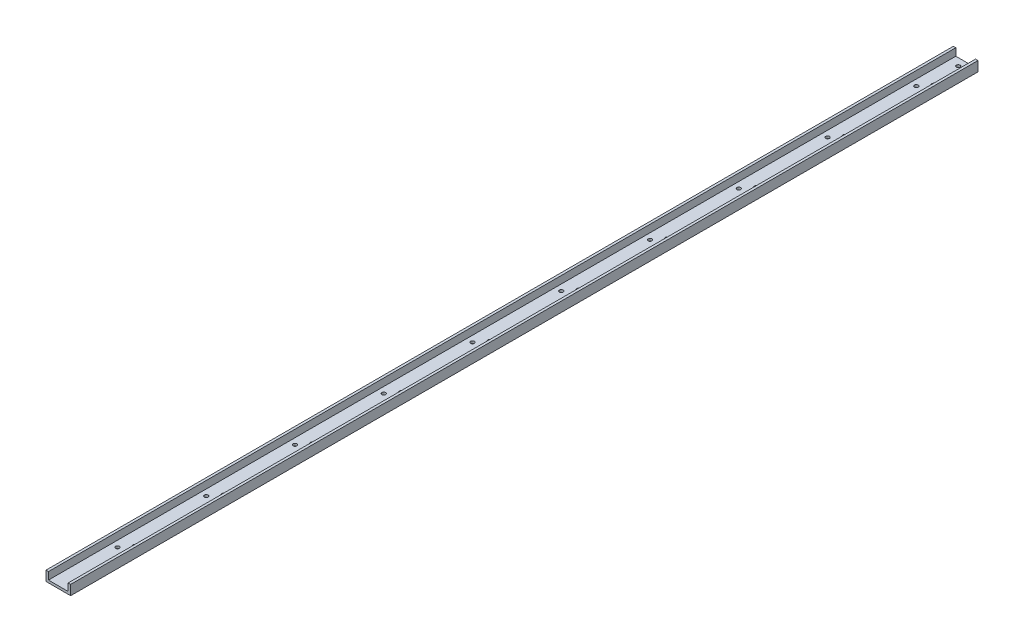
ISO-10303-21;
HEADER;
FILE_DESCRIPTION(('STEP AP214'),'2;1');
FILE_NAME('part.step','',(''),(''),'','','');
FILE_SCHEMA(('AUTOMOTIVE_DESIGN { 1 0 10303 214 1 1 1 1 }'));
ENDSEC;
DATA;
#1=APPLICATION_CONTEXT('core data for automotive mechanical design processes');
#2=APPLICATION_PROTOCOL_DEFINITION('international standard','automotive_design',2000,#1);
#3=PRODUCT_CONTEXT('',#1,'mechanical');
#4=PRODUCT('Part','Part','',(#3));
#5=PRODUCT_RELATED_PRODUCT_CATEGORY('part','',(#4));
#6=PRODUCT_DEFINITION_FORMATION('','',#4);
#7=PRODUCT_DEFINITION_CONTEXT('part definition',#1,'design');
#8=PRODUCT_DEFINITION('design','',#6,#7);
#9=PRODUCT_DEFINITION_SHAPE('','',#8);
#10=(LENGTH_UNIT() NAMED_UNIT(*) SI_UNIT(.MILLI.,.METRE.));
#11=(NAMED_UNIT(*) PLANE_ANGLE_UNIT() SI_UNIT($,.RADIAN.));
#12=(NAMED_UNIT(*) SI_UNIT($,.STERADIAN.) SOLID_ANGLE_UNIT());
#13=UNCERTAINTY_MEASURE_WITH_UNIT(LENGTH_MEASURE(1.E-05),#10,'distance_accuracy_value','');
#14=(GEOMETRIC_REPRESENTATION_CONTEXT(3) GLOBAL_UNCERTAINTY_ASSIGNED_CONTEXT((#13)) GLOBAL_UNIT_ASSIGNED_CONTEXT((#10,
#11,#12)) REPRESENTATION_CONTEXT('',''));
#15=CARTESIAN_POINT('',(0.,0.,0.));
#16=DIRECTION('',(0.,0.,1.));
#17=DIRECTION('',(1.,0.,0.));
#18=AXIS2_PLACEMENT_3D('',#15,#16,#17);
#19=CARTESIAN_POINT('',(20.6375,-0.00100000000000013,-93.6624999999999));
#20=DIRECTION('',(0.,1.,0.));
#21=DIRECTION('',(0.,0.,-1.));
#22=AXIS2_PLACEMENT_3D('',#19,#20,#21);
#23=CYLINDRICAL_SURFACE('',#22,2.41300000000001);
#24=CARTESIAN_POINT('',(20.6375,3.175,-93.6624999999999));
#25=DIRECTION('',(0.,-1.,0.));
#26=DIRECTION('',(0.,0.,-1.));
#27=AXIS2_PLACEMENT_3D('',#24,#25,#26);
#28=CIRCLE('',#27,2.41300000000001);
#29=CARTESIAN_POINT('',(20.6375,3.175,-96.0754999999999));
#30=VERTEX_POINT('',#29);
#31=EDGE_CURVE('E43',#30,#30,#28,.T.);
#32=ORIENTED_EDGE('',*,*,#31,.F.);
#33=EDGE_LOOP('',(#32));
#34=FACE_BOUND('',#33,.T.);
#35=CARTESIAN_POINT('',(20.6375,0.,-93.6624999999999));
#36=DIRECTION('',(0.,-1.,0.));
#37=DIRECTION('',(0.,0.,-1.));
#38=AXIS2_PLACEMENT_3D('',#35,#36,#37);
#39=CIRCLE('',#38,2.41300000000001);
#40=CARTESIAN_POINT('',(20.6375,0.,-96.0754999999999));
#41=VERTEX_POINT('',#40);
#42=EDGE_CURVE('E11',#41,#41,#39,.F.);
#43=ORIENTED_EDGE('',*,*,#42,.F.);
#44=EDGE_LOOP('',(#43));
#45=FACE_BOUND('',#44,.T.);
#46=ADVANCED_FACE('F35',(#34,#45),#23,.F.);
#47=CARTESIAN_POINT('',(20.6375,-0.00100000000000013,-207.9625));
#48=DIRECTION('',(0.,1.,0.));
#49=DIRECTION('',(0.,0.,-1.));
#50=AXIS2_PLACEMENT_3D('',#47,#48,#49);
#51=CYLINDRICAL_SURFACE('',#50,2.41300000000001);
#52=CARTESIAN_POINT('',(20.6375,3.175,-207.9625));
#53=DIRECTION('',(0.,-1.,0.));
#54=DIRECTION('',(0.,0.,-1.));
#55=AXIS2_PLACEMENT_3D('',#52,#53,#54);
#56=CIRCLE('',#55,2.41300000000001);
#57=CARTESIAN_POINT('',(20.6375,3.175,-210.3755));
#58=VERTEX_POINT('',#57);
#59=EDGE_CURVE('E251',#58,#58,#56,.T.);
#60=ORIENTED_EDGE('',*,*,#59,.F.);
#61=EDGE_LOOP('',(#60));
#62=FACE_BOUND('',#61,.T.);
#63=CARTESIAN_POINT('',(20.6375,0.,-207.9625));
#64=DIRECTION('',(0.,-1.,0.));
#65=DIRECTION('',(0.,0.,-1.));
#66=AXIS2_PLACEMENT_3D('',#63,#64,#65);
#67=CIRCLE('',#66,2.41300000000001);
#68=CARTESIAN_POINT('',(20.6375,0.,-210.3755));
#69=VERTEX_POINT('',#68);
#70=EDGE_CURVE('E254',#69,#69,#67,.F.);
#71=ORIENTED_EDGE('',*,*,#70,.F.);
#72=EDGE_LOOP('',(#71));
#73=FACE_BOUND('',#72,.T.);
#74=ADVANCED_FACE('F262',(#62,#73),#51,.F.);
#75=CARTESIAN_POINT('',(20.6375,-0.00100000000000013,-322.2625));
#76=DIRECTION('',(0.,1.,0.));
#77=DIRECTION('',(0.,0.,-1.));
#78=AXIS2_PLACEMENT_3D('',#75,#76,#77);
#79=CYLINDRICAL_SURFACE('',#78,2.41300000000001);
#80=CARTESIAN_POINT('',(20.6375,3.175,-322.2625));
#81=DIRECTION('',(0.,-1.,0.));
#82=DIRECTION('',(0.,0.,-1.));
#83=AXIS2_PLACEMENT_3D('',#80,#81,#82);
#84=CIRCLE('',#83,2.41300000000001);
#85=CARTESIAN_POINT('',(20.6375,3.175,-324.6755));
#86=VERTEX_POINT('',#85);
#87=EDGE_CURVE('E245',#86,#86,#84,.T.);
#88=ORIENTED_EDGE('',*,*,#87,.F.);
#89=EDGE_LOOP('',(#88));
#90=FACE_BOUND('',#89,.T.);
#91=CARTESIAN_POINT('',(20.6375,0.,-322.2625));
#92=DIRECTION('',(0.,-1.,0.));
#93=DIRECTION('',(0.,0.,-1.));
#94=AXIS2_PLACEMENT_3D('',#91,#92,#93);
#95=CIRCLE('',#94,2.41300000000001);
#96=CARTESIAN_POINT('',(20.6375,0.,-324.6755));
#97=VERTEX_POINT('',#96);
#98=EDGE_CURVE('E248',#97,#97,#95,.F.);
#99=ORIENTED_EDGE('',*,*,#98,.F.);
#100=EDGE_LOOP('',(#99));
#101=FACE_BOUND('',#100,.T.);
#102=ADVANCED_FACE('F335',(#90,#101),#79,.F.);
#103=CARTESIAN_POINT('',(20.6375,-0.00100000000000013,-436.5625));
#104=DIRECTION('',(0.,1.,0.));
#105=DIRECTION('',(0.,0.,-1.));
#106=AXIS2_PLACEMENT_3D('',#103,#104,#105);
#107=CYLINDRICAL_SURFACE('',#106,2.41300000000001);
#108=CARTESIAN_POINT('',(20.6375,3.175,-436.5625));
#109=DIRECTION('',(0.,-1.,0.));
#110=DIRECTION('',(0.,0.,-1.));
#111=AXIS2_PLACEMENT_3D('',#108,#109,#110);
#112=CIRCLE('',#111,2.41300000000001);
#113=CARTESIAN_POINT('',(20.6375,3.175,-438.9755));
#114=VERTEX_POINT('',#113);
#115=EDGE_CURVE('E239',#114,#114,#112,.T.);
#116=ORIENTED_EDGE('',*,*,#115,.F.);
#117=EDGE_LOOP('',(#116));
#118=FACE_BOUND('',#117,.T.);
#119=CARTESIAN_POINT('',(20.6375,0.,-436.5625));
#120=DIRECTION('',(0.,-1.,0.));
#121=DIRECTION('',(0.,0.,-1.));
#122=AXIS2_PLACEMENT_3D('',#119,#120,#121);
#123=CIRCLE('',#122,2.41300000000001);
#124=CARTESIAN_POINT('',(20.6375,0.,-438.9755));
#125=VERTEX_POINT('',#124);
#126=EDGE_CURVE('E242',#125,#125,#123,.F.);
#127=ORIENTED_EDGE('',*,*,#126,.F.);
#128=EDGE_LOOP('',(#127));
#129=FACE_BOUND('',#128,.T.);
#130=ADVANCED_FACE('F331',(#118,#129),#107,.F.);
#131=CARTESIAN_POINT('',(20.6375,-0.00100000000000013,-550.8625));
#132=DIRECTION('',(0.,1.,0.));
#133=DIRECTION('',(0.,0.,-1.));
#134=AXIS2_PLACEMENT_3D('',#131,#132,#133);
#135=CYLINDRICAL_SURFACE('',#134,2.41300000000001);
#136=CARTESIAN_POINT('',(20.6375,3.175,-550.8625));
#137=DIRECTION('',(0.,-1.,0.));
#138=DIRECTION('',(0.,0.,-1.));
#139=AXIS2_PLACEMENT_3D('',#136,#137,#138);
#140=CIRCLE('',#139,2.41300000000001);
#141=CARTESIAN_POINT('',(20.6375,3.175,-553.2755));
#142=VERTEX_POINT('',#141);
#143=EDGE_CURVE('E233',#142,#142,#140,.T.);
#144=ORIENTED_EDGE('',*,*,#143,.F.);
#145=EDGE_LOOP('',(#144));
#146=FACE_BOUND('',#145,.T.);
#147=CARTESIAN_POINT('',(20.6375,0.,-550.8625));
#148=DIRECTION('',(0.,-1.,0.));
#149=DIRECTION('',(0.,0.,-1.));
#150=AXIS2_PLACEMENT_3D('',#147,#148,#149);
#151=CIRCLE('',#150,2.41300000000001);
#152=CARTESIAN_POINT('',(20.6375,0.,-553.2755));
#153=VERTEX_POINT('',#152);
#154=EDGE_CURVE('E236',#153,#153,#151,.F.);
#155=ORIENTED_EDGE('',*,*,#154,.F.);
#156=EDGE_LOOP('',(#155));
#157=FACE_BOUND('',#156,.T.);
#158=ADVANCED_FACE('F327',(#146,#157),#135,.F.);
#159=CARTESIAN_POINT('',(20.6375,-0.00100000000000013,-665.1625));
#160=DIRECTION('',(0.,1.,0.));
#161=DIRECTION('',(0.,0.,-1.));
#162=AXIS2_PLACEMENT_3D('',#159,#160,#161);
#163=CYLINDRICAL_SURFACE('',#162,2.41300000000001);
#164=CARTESIAN_POINT('',(20.6375,3.175,-665.1625));
#165=DIRECTION('',(0.,-1.,0.));
#166=DIRECTION('',(0.,0.,-1.));
#167=AXIS2_PLACEMENT_3D('',#164,#165,#166);
#168=CIRCLE('',#167,2.41300000000001);
#169=CARTESIAN_POINT('',(20.6375,3.175,-667.5755));
#170=VERTEX_POINT('',#169);
#171=EDGE_CURVE('E227',#170,#170,#168,.T.);
#172=ORIENTED_EDGE('',*,*,#171,.F.);
#173=EDGE_LOOP('',(#172));
#174=FACE_BOUND('',#173,.T.);
#175=CARTESIAN_POINT('',(20.6375,0.,-665.1625));
#176=DIRECTION('',(0.,-1.,0.));
#177=DIRECTION('',(0.,0.,-1.));
#178=AXIS2_PLACEMENT_3D('',#175,#176,#177);
#179=CIRCLE('',#178,2.41300000000001);
#180=CARTESIAN_POINT('',(20.6375,0.,-667.5755));
#181=VERTEX_POINT('',#180);
#182=EDGE_CURVE('E230',#181,#181,#179,.F.);
#183=ORIENTED_EDGE('',*,*,#182,.F.);
#184=EDGE_LOOP('',(#183));
#185=FACE_BOUND('',#184,.T.);
#186=ADVANCED_FACE('F323',(#174,#185),#163,.F.);
#187=CARTESIAN_POINT('',(20.6375,-0.00100000000000013,-779.4625));
#188=DIRECTION('',(0.,1.,0.));
#189=DIRECTION('',(0.,0.,-1.));
#190=AXIS2_PLACEMENT_3D('',#187,#188,#189);
#191=CYLINDRICAL_SURFACE('',#190,2.41300000000001);
#192=CARTESIAN_POINT('',(20.6375,3.175,-779.4625));
#193=DIRECTION('',(0.,-1.,0.));
#194=DIRECTION('',(0.,0.,-1.));
#195=AXIS2_PLACEMENT_3D('',#192,#193,#194);
#196=CIRCLE('',#195,2.41300000000001);
#197=CARTESIAN_POINT('',(20.6375,3.175,-781.8755));
#198=VERTEX_POINT('',#197);
#199=EDGE_CURVE('E221',#198,#198,#196,.T.);
#200=ORIENTED_EDGE('',*,*,#199,.F.);
#201=EDGE_LOOP('',(#200));
#202=FACE_BOUND('',#201,.T.);
#203=CARTESIAN_POINT('',(20.6375,0.,-779.4625));
#204=DIRECTION('',(0.,-1.,0.));
#205=DIRECTION('',(0.,0.,-1.));
#206=AXIS2_PLACEMENT_3D('',#203,#204,#205);
#207=CIRCLE('',#206,2.41300000000001);
#208=CARTESIAN_POINT('',(20.6375,0.,-781.8755));
#209=VERTEX_POINT('',#208);
#210=EDGE_CURVE('E224',#209,#209,#207,.F.);
#211=ORIENTED_EDGE('',*,*,#210,.F.);
#212=EDGE_LOOP('',(#211));
#213=FACE_BOUND('',#212,.T.);
#214=ADVANCED_FACE('F319',(#202,#213),#191,.F.);
#215=CARTESIAN_POINT('',(20.6375,-0.00100000000000013,-893.7625));
#216=DIRECTION('',(0.,1.,0.));
#217=DIRECTION('',(0.,0.,-1.));
#218=AXIS2_PLACEMENT_3D('',#215,#216,#217);
#219=CYLINDRICAL_SURFACE('',#218,2.41300000000001);
#220=CARTESIAN_POINT('',(20.6375,3.175,-893.7625));
#221=DIRECTION('',(0.,-1.,0.));
#222=DIRECTION('',(0.,0.,-1.));
#223=AXIS2_PLACEMENT_3D('',#220,#221,#222);
#224=CIRCLE('',#223,2.41300000000001);
#225=CARTESIAN_POINT('',(20.6375,3.175,-896.1755));
#226=VERTEX_POINT('',#225);
#227=EDGE_CURVE('E215',#226,#226,#224,.T.);
#228=ORIENTED_EDGE('',*,*,#227,.F.);
#229=EDGE_LOOP('',(#228));
#230=FACE_BOUND('',#229,.T.);
#231=CARTESIAN_POINT('',(20.6375,0.,-893.7625));
#232=DIRECTION('',(0.,-1.,0.));
#233=DIRECTION('',(0.,0.,-1.));
#234=AXIS2_PLACEMENT_3D('',#231,#232,#233);
#235=CIRCLE('',#234,2.41300000000001);
#236=CARTESIAN_POINT('',(20.6375,0.,-896.1755));
#237=VERTEX_POINT('',#236);
#238=EDGE_CURVE('E218',#237,#237,#235,.F.);
#239=ORIENTED_EDGE('',*,*,#238,.F.);
#240=EDGE_LOOP('',(#239));
#241=FACE_BOUND('',#240,.T.);
#242=ADVANCED_FACE('F315',(#230,#241),#219,.F.);
#243=CARTESIAN_POINT('',(11.1125,-0.00100000000000013,-80.9625));
#244=DIRECTION('',(0.,1.,0.));
#245=DIRECTION('',(0.,0.,-1.));
#246=AXIS2_PLACEMENT_3D('',#243,#244,#245);
#247=CYLINDRICAL_SURFACE('',#246,2.41300000000005);
#248=CARTESIAN_POINT('',(11.1125,3.175,-80.9625));
#249=DIRECTION('',(0.,-1.,0.));
#250=DIRECTION('',(0.,0.,-1.));
#251=AXIS2_PLACEMENT_3D('',#248,#249,#250);
#252=CIRCLE('',#251,2.41300000000005);
#253=CARTESIAN_POINT('',(11.1125,3.175,-83.3755000000001));
#254=VERTEX_POINT('',#253);
#255=EDGE_CURVE('E209',#254,#254,#252,.T.);
#256=ORIENTED_EDGE('',*,*,#255,.F.);
#257=EDGE_LOOP('',(#256));
#258=FACE_BOUND('',#257,.T.);
#259=CARTESIAN_POINT('',(11.1125,0.,-80.9625));
#260=DIRECTION('',(0.,-1.,0.));
#261=DIRECTION('',(0.,0.,-1.));
#262=AXIS2_PLACEMENT_3D('',#259,#260,#261);
#263=CIRCLE('',#262,2.41300000000005);
#264=CARTESIAN_POINT('',(11.1125,0.,-83.3755000000001));
#265=VERTEX_POINT('',#264);
#266=EDGE_CURVE('E212',#265,#265,#263,.F.);
#267=ORIENTED_EDGE('',*,*,#266,.F.);
#268=EDGE_LOOP('',(#267));
#269=FACE_BOUND('',#268,.T.);
#270=ADVANCED_FACE('F311',(#258,#269),#247,.F.);
#271=CARTESIAN_POINT('',(11.1125,-0.00100000000000013,-195.2625));
#272=DIRECTION('',(0.,1.,0.));
#273=DIRECTION('',(0.,0.,-1.));
#274=AXIS2_PLACEMENT_3D('',#271,#272,#273);
#275=CYLINDRICAL_SURFACE('',#274,2.41300000000005);
#276=CARTESIAN_POINT('',(11.1125,3.175,-195.2625));
#277=DIRECTION('',(0.,-1.,0.));
#278=DIRECTION('',(0.,0.,-1.));
#279=AXIS2_PLACEMENT_3D('',#276,#277,#278);
#280=CIRCLE('',#279,2.41300000000005);
#281=CARTESIAN_POINT('',(11.1125,3.175,-197.6755));
#282=VERTEX_POINT('',#281);
#283=EDGE_CURVE('E203',#282,#282,#280,.T.);
#284=ORIENTED_EDGE('',*,*,#283,.F.);
#285=EDGE_LOOP('',(#284));
#286=FACE_BOUND('',#285,.T.);
#287=CARTESIAN_POINT('',(11.1125,0.,-195.2625));
#288=DIRECTION('',(0.,-1.,0.));
#289=DIRECTION('',(0.,0.,-1.));
#290=AXIS2_PLACEMENT_3D('',#287,#288,#289);
#291=CIRCLE('',#290,2.41300000000005);
#292=CARTESIAN_POINT('',(11.1125,0.,-197.6755));
#293=VERTEX_POINT('',#292);
#294=EDGE_CURVE('E206',#293,#293,#291,.F.);
#295=ORIENTED_EDGE('',*,*,#294,.F.);
#296=EDGE_LOOP('',(#295));
#297=FACE_BOUND('',#296,.T.);
#298=ADVANCED_FACE('F307',(#286,#297),#275,.F.);
#299=CARTESIAN_POINT('',(11.1125,-0.00100000000000013,-309.5625));
#300=DIRECTION('',(0.,1.,0.));
#301=DIRECTION('',(0.,0.,-1.));
#302=AXIS2_PLACEMENT_3D('',#299,#300,#301);
#303=CYLINDRICAL_SURFACE('',#302,2.41300000000005);
#304=CARTESIAN_POINT('',(11.1125,3.175,-309.5625));
#305=DIRECTION('',(0.,-1.,0.));
#306=DIRECTION('',(0.,0.,-1.));
#307=AXIS2_PLACEMENT_3D('',#304,#305,#306);
#308=CIRCLE('',#307,2.41300000000005);
#309=CARTESIAN_POINT('',(11.1125,3.175,-311.9755));
#310=VERTEX_POINT('',#309);
#311=EDGE_CURVE('E197',#310,#310,#308,.T.);
#312=ORIENTED_EDGE('',*,*,#311,.F.);
#313=EDGE_LOOP('',(#312));
#314=FACE_BOUND('',#313,.T.);
#315=CARTESIAN_POINT('',(11.1125,0.,-309.5625));
#316=DIRECTION('',(0.,-1.,0.));
#317=DIRECTION('',(0.,0.,-1.));
#318=AXIS2_PLACEMENT_3D('',#315,#316,#317);
#319=CIRCLE('',#318,2.41300000000005);
#320=CARTESIAN_POINT('',(11.1125,0.,-311.9755));
#321=VERTEX_POINT('',#320);
#322=EDGE_CURVE('E200',#321,#321,#319,.F.);
#323=ORIENTED_EDGE('',*,*,#322,.F.);
#324=EDGE_LOOP('',(#323));
#325=FACE_BOUND('',#324,.T.);
#326=ADVANCED_FACE('F303',(#314,#325),#303,.F.);
#327=CARTESIAN_POINT('',(11.1125,-0.00100000000000013,-423.8625));
#328=DIRECTION('',(0.,1.,0.));
#329=DIRECTION('',(0.,0.,-1.));
#330=AXIS2_PLACEMENT_3D('',#327,#328,#329);
#331=CYLINDRICAL_SURFACE('',#330,2.41300000000005);
#332=CARTESIAN_POINT('',(11.1125,3.175,-423.8625));
#333=DIRECTION('',(0.,-1.,0.));
#334=DIRECTION('',(0.,0.,-1.));
#335=AXIS2_PLACEMENT_3D('',#332,#333,#334);
#336=CIRCLE('',#335,2.41300000000005);
#337=CARTESIAN_POINT('',(11.1125,3.175,-426.2755));
#338=VERTEX_POINT('',#337);
#339=EDGE_CURVE('E191',#338,#338,#336,.T.);
#340=ORIENTED_EDGE('',*,*,#339,.F.);
#341=EDGE_LOOP('',(#340));
#342=FACE_BOUND('',#341,.T.);
#343=CARTESIAN_POINT('',(11.1125,0.,-423.8625));
#344=DIRECTION('',(0.,-1.,0.));
#345=DIRECTION('',(0.,0.,-1.));
#346=AXIS2_PLACEMENT_3D('',#343,#344,#345);
#347=CIRCLE('',#346,2.41300000000005);
#348=CARTESIAN_POINT('',(11.1125,0.,-426.2755));
#349=VERTEX_POINT('',#348);
#350=EDGE_CURVE('E194',#349,#349,#347,.F.);
#351=ORIENTED_EDGE('',*,*,#350,.F.);
#352=EDGE_LOOP('',(#351));
#353=FACE_BOUND('',#352,.T.);
#354=ADVANCED_FACE('F299',(#342,#353),#331,.F.);
#355=CARTESIAN_POINT('',(11.1125,-0.00100000000000013,-538.1625));
#356=DIRECTION('',(0.,1.,0.));
#357=DIRECTION('',(0.,0.,-1.));
#358=AXIS2_PLACEMENT_3D('',#355,#356,#357);
#359=CYLINDRICAL_SURFACE('',#358,2.41300000000005);
#360=CARTESIAN_POINT('',(11.1125,3.175,-538.1625));
#361=DIRECTION('',(0.,-1.,0.));
#362=DIRECTION('',(0.,0.,-1.));
#363=AXIS2_PLACEMENT_3D('',#360,#361,#362);
#364=CIRCLE('',#363,2.41300000000005);
#365=CARTESIAN_POINT('',(11.1125,3.175,-540.5755));
#366=VERTEX_POINT('',#365);
#367=EDGE_CURVE('E185',#366,#366,#364,.T.);
#368=ORIENTED_EDGE('',*,*,#367,.F.);
#369=EDGE_LOOP('',(#368));
#370=FACE_BOUND('',#369,.T.);
#371=CARTESIAN_POINT('',(11.1125,0.,-538.1625));
#372=DIRECTION('',(0.,-1.,0.));
#373=DIRECTION('',(0.,0.,-1.));
#374=AXIS2_PLACEMENT_3D('',#371,#372,#373);
#375=CIRCLE('',#374,2.41300000000005);
#376=CARTESIAN_POINT('',(11.1125,0.,-540.5755));
#377=VERTEX_POINT('',#376);
#378=EDGE_CURVE('E188',#377,#377,#375,.F.);
#379=ORIENTED_EDGE('',*,*,#378,.F.);
#380=EDGE_LOOP('',(#379));
#381=FACE_BOUND('',#380,.T.);
#382=ADVANCED_FACE('F295',(#370,#381),#359,.F.);
#383=CARTESIAN_POINT('',(11.1125,-0.00100000000000013,-652.4625));
#384=DIRECTION('',(0.,1.,0.));
#385=DIRECTION('',(0.,0.,-1.));
#386=AXIS2_PLACEMENT_3D('',#383,#384,#385);
#387=CYLINDRICAL_SURFACE('',#386,2.41300000000005);
#388=CARTESIAN_POINT('',(11.1125,3.175,-652.4625));
#389=DIRECTION('',(0.,-1.,0.));
#390=DIRECTION('',(0.,0.,-1.));
#391=AXIS2_PLACEMENT_3D('',#388,#389,#390);
#392=CIRCLE('',#391,2.41300000000005);
#393=CARTESIAN_POINT('',(11.1125,3.175,-654.8755));
#394=VERTEX_POINT('',#393);
#395=EDGE_CURVE('E179',#394,#394,#392,.T.);
#396=ORIENTED_EDGE('',*,*,#395,.F.);
#397=EDGE_LOOP('',(#396));
#398=FACE_BOUND('',#397,.T.);
#399=CARTESIAN_POINT('',(11.1125,0.,-652.4625));
#400=DIRECTION('',(0.,-1.,0.));
#401=DIRECTION('',(0.,0.,-1.));
#402=AXIS2_PLACEMENT_3D('',#399,#400,#401);
#403=CIRCLE('',#402,2.41300000000005);
#404=CARTESIAN_POINT('',(11.1125,0.,-654.8755));
#405=VERTEX_POINT('',#404);
#406=EDGE_CURVE('E182',#405,#405,#403,.F.);
#407=ORIENTED_EDGE('',*,*,#406,.F.);
#408=EDGE_LOOP('',(#407));
#409=FACE_BOUND('',#408,.T.);
#410=ADVANCED_FACE('F291',(#398,#409),#387,.F.);
#411=CARTESIAN_POINT('',(11.1125,-0.00100000000000013,-766.7625));
#412=DIRECTION('',(0.,1.,0.));
#413=DIRECTION('',(0.,0.,-1.));
#414=AXIS2_PLACEMENT_3D('',#411,#412,#413);
#415=CYLINDRICAL_SURFACE('',#414,2.41300000000005);
#416=CARTESIAN_POINT('',(11.1125,3.175,-766.7625));
#417=DIRECTION('',(0.,-1.,0.));
#418=DIRECTION('',(0.,0.,-1.));
#419=AXIS2_PLACEMENT_3D('',#416,#417,#418);
#420=CIRCLE('',#419,2.41300000000005);
#421=CARTESIAN_POINT('',(11.1125,3.175,-769.1755));
#422=VERTEX_POINT('',#421);
#423=EDGE_CURVE('E173',#422,#422,#420,.T.);
#424=ORIENTED_EDGE('',*,*,#423,.F.);
#425=EDGE_LOOP('',(#424));
#426=FACE_BOUND('',#425,.T.);
#427=CARTESIAN_POINT('',(11.1125,0.,-766.7625));
#428=DIRECTION('',(0.,-1.,0.));
#429=DIRECTION('',(0.,0.,-1.));
#430=AXIS2_PLACEMENT_3D('',#427,#428,#429);
#431=CIRCLE('',#430,2.41300000000005);
#432=CARTESIAN_POINT('',(11.1125,0.,-769.1755));
#433=VERTEX_POINT('',#432);
#434=EDGE_CURVE('E176',#433,#433,#431,.F.);
#435=ORIENTED_EDGE('',*,*,#434,.F.);
#436=EDGE_LOOP('',(#435));
#437=FACE_BOUND('',#436,.T.);
#438=ADVANCED_FACE('F287',(#426,#437),#415,.F.);
#439=CARTESIAN_POINT('',(11.1125,-0.00100000000000013,-881.0625));
#440=DIRECTION('',(0.,1.,0.));
#441=DIRECTION('',(0.,0.,-1.));
#442=AXIS2_PLACEMENT_3D('',#439,#440,#441);
#443=CYLINDRICAL_SURFACE('',#442,2.41300000000005);
#444=CARTESIAN_POINT('',(11.1125,3.175,-881.0625));
#445=DIRECTION('',(0.,-1.,0.));
#446=DIRECTION('',(0.,0.,-1.));
#447=AXIS2_PLACEMENT_3D('',#444,#445,#446);
#448=CIRCLE('',#447,2.41300000000005);
#449=CARTESIAN_POINT('',(11.1125,3.175,-883.4755));
#450=VERTEX_POINT('',#449);
#451=EDGE_CURVE('E167',#450,#450,#448,.T.);
#452=ORIENTED_EDGE('',*,*,#451,.F.);
#453=EDGE_LOOP('',(#452));
#454=FACE_BOUND('',#453,.T.);
#455=CARTESIAN_POINT('',(11.1125,0.,-881.0625));
#456=DIRECTION('',(0.,-1.,0.));
#457=DIRECTION('',(0.,0.,-1.));
#458=AXIS2_PLACEMENT_3D('',#455,#456,#457);
#459=CIRCLE('',#458,2.41300000000005);
#460=CARTESIAN_POINT('',(11.1125,0.,-883.4755));
#461=VERTEX_POINT('',#460);
#462=EDGE_CURVE('E170',#461,#461,#459,.F.);
#463=ORIENTED_EDGE('',*,*,#462,.F.);
#464=EDGE_LOOP('',(#463));
#465=FACE_BOUND('',#464,.T.);
#466=ADVANCED_FACE('F278',(#454,#465),#443,.F.);
#467=CARTESIAN_POINT('',(0.,0.,-1168.4));
#468=DIRECTION('',(1.,0.,0.));
#469=DIRECTION('',(0.,0.,1.));
#470=AXIS2_PLACEMENT_3D('',#467,#468,#469);
#471=PLANE('',#470);
#472=DIRECTION('',(0.,-1.,0.));
#473=VECTOR('',#472,1.);
#474=CARTESIAN_POINT('',(0.,0.,0.));
#475=LINE('',#474,#473);
#476=CARTESIAN_POINT('',(0.,12.7,0.));
#477=VERTEX_POINT('',#476);
#478=CARTESIAN_POINT('',(0.,0.,0.));
#479=VERTEX_POINT('',#478);
#480=EDGE_CURVE('E132',#477,#479,#475,.T.);
#481=ORIENTED_EDGE('',*,*,#480,.F.);
#482=DIRECTION('',(0.,0.,1.));
#483=VECTOR('',#482,1.);
#484=CARTESIAN_POINT('',(0.,12.7,-1168.4));
#485=LINE('',#484,#483);
#486=CARTESIAN_POINT('',(0.,12.7,-1168.4));
#487=VERTEX_POINT('',#486);
#488=EDGE_CURVE('E131',#487,#477,#485,.T.);
#489=ORIENTED_EDGE('',*,*,#488,.F.);
#490=DIRECTION('',(0.,-1.,0.));
#491=VECTOR('',#490,1.);
#492=CARTESIAN_POINT('',(0.,0.,-1168.4));
#493=LINE('',#492,#491);
#494=CARTESIAN_POINT('',(0.,0.,-1168.4));
#495=VERTEX_POINT('',#494);
#496=EDGE_CURVE('E151',#487,#495,#493,.T.);
#497=ORIENTED_EDGE('',*,*,#496,.T.);
#498=DIRECTION('',(0.,0.,1.));
#499=VECTOR('',#498,1.);
#500=CARTESIAN_POINT('',(0.,0.,-1168.4));
#501=LINE('',#500,#499);
#502=EDGE_CURVE('E164',#495,#479,#501,.T.);
#503=ORIENTED_EDGE('',*,*,#502,.T.);
#504=EDGE_LOOP('',(#481,#489,#497,#503));
#505=FACE_BOUND('',#504,.T.);
#506=ADVANCED_FACE('F268',(#505),#471,.F.);
#507=CARTESIAN_POINT('',(0.,0.,-1168.4));
#508=DIRECTION('',(0.,1.,0.));
#509=DIRECTION('',(0.,0.,-1.));
#510=AXIS2_PLACEMENT_3D('',#507,#508,#509);
#511=PLANE('',#510);
#512=CARTESIAN_POINT('',(20.6375,0.,-1008.0625));
#513=DIRECTION('',(0.,-1.,0.));
#514=DIRECTION('',(0.,0.,-1.));
#515=AXIS2_PLACEMENT_3D('',#512,#513,#514);
#516=CIRCLE('',#515,2.41300000000001);
#517=CARTESIAN_POINT('',(20.6375,0.,-1010.4755));
#518=VERTEX_POINT('',#517);
#519=EDGE_CURVE('E406',#518,#518,#516,.F.);
#520=ORIENTED_EDGE('',*,*,#519,.T.);
#521=EDGE_LOOP('',(#520));
#522=FACE_BOUND('',#521,.T.);
#523=CARTESIAN_POINT('',(11.1125,0.,-995.3625));
#524=DIRECTION('',(0.,-1.,0.));
#525=DIRECTION('',(0.,0.,-1.));
#526=AXIS2_PLACEMENT_3D('',#523,#524,#525);
#527=CIRCLE('',#526,2.41300000000005);
#528=CARTESIAN_POINT('',(11.1125,0.,-997.7755));
#529=VERTEX_POINT('',#528);
#530=EDGE_CURVE('E400',#529,#529,#527,.F.);
#531=ORIENTED_EDGE('',*,*,#530,.T.);
#532=EDGE_LOOP('',(#531));
#533=FACE_BOUND('',#532,.T.);
#534=CARTESIAN_POINT('',(15.875,0.,-1158.875));
#535=DIRECTION('',(0.,-1.,0.));
#536=DIRECTION('',(0.,0.,-1.));
#537=AXIS2_PLACEMENT_3D('',#534,#535,#536);
#538=CIRCLE('',#537,2.41299999999998);
#539=CARTESIAN_POINT('',(15.875,0.,-1161.288));
#540=VERTEX_POINT('',#539);
#541=EDGE_CURVE('E390',#540,#540,#538,.F.);
#542=ORIENTED_EDGE('',*,*,#541,.T.);
#543=EDGE_LOOP('',(#542));
#544=FACE_BOUND('',#543,.T.);
#545=CARTESIAN_POINT('',(11.1125,0.,-1109.6625));
#546=DIRECTION('',(0.,-1.,0.));
#547=DIRECTION('',(0.,0.,-1.));
#548=AXIS2_PLACEMENT_3D('',#545,#546,#547);
#549=CIRCLE('',#548,2.41300000000005);
#550=CARTESIAN_POINT('',(11.1125,0.,-1112.0755));
#551=VERTEX_POINT('',#550);
#552=EDGE_CURVE('E135',#551,#551,#549,.F.);
#553=ORIENTED_EDGE('',*,*,#552,.T.);
#554=EDGE_LOOP('',(#553));
#555=FACE_BOUND('',#554,.T.);
#556=CARTESIAN_POINT('',(20.6375,0.,-1122.3625));
#557=DIRECTION('',(0.,-1.,0.));
#558=DIRECTION('',(0.,0.,-1.));
#559=AXIS2_PLACEMENT_3D('',#556,#557,#558);
#560=CIRCLE('',#559,2.41300000000001);
#561=CARTESIAN_POINT('',(20.6375,0.,-1124.7755));
#562=VERTEX_POINT('',#561);
#563=EDGE_CURVE('E382',#562,#562,#560,.F.);
#564=ORIENTED_EDGE('',*,*,#563,.T.);
#565=EDGE_LOOP('',(#564));
#566=FACE_BOUND('',#565,.T.);
#567=DIRECTION('',(1.,0.,0.));
#568=VECTOR('',#567,1.);
#569=CARTESIAN_POINT('',(0.,0.,0.));
#570=LINE('',#569,#568);
#571=CARTESIAN_POINT('',(31.75,0.,0.));
#572=VERTEX_POINT('',#571);
#573=EDGE_CURVE('E134',#479,#572,#570,.T.);
#574=ORIENTED_EDGE('',*,*,#573,.F.);
#575=ORIENTED_EDGE('',*,*,#502,.F.);
#576=DIRECTION('',(1.,0.,0.));
#577=VECTOR('',#576,1.);
#578=CARTESIAN_POINT('',(0.,0.,-1168.4));
#579=LINE('',#578,#577);
#580=CARTESIAN_POINT('',(31.75,0.,-1168.4));
#581=VERTEX_POINT('',#580);
#582=EDGE_CURVE('E89',#495,#581,#579,.T.);
#583=ORIENTED_EDGE('',*,*,#582,.T.);
#584=DIRECTION('',(0.,0.,1.));
#585=VECTOR('',#584,1.);
#586=CARTESIAN_POINT('',(31.75,0.,-1168.4));
#587=LINE('',#586,#585);
#588=EDGE_CURVE('E161',#581,#572,#587,.T.);
#589=ORIENTED_EDGE('',*,*,#588,.T.);
#590=EDGE_LOOP('',(#574,#575,#583,#589));
#591=FACE_BOUND('',#590,.T.);
#592=ORIENTED_EDGE('',*,*,#462,.T.);
#593=EDGE_LOOP('',(#592));
#594=FACE_BOUND('',#593,.T.);
#595=ORIENTED_EDGE('',*,*,#434,.T.);
#596=EDGE_LOOP('',(#595));
#597=FACE_BOUND('',#596,.T.);
#598=ORIENTED_EDGE('',*,*,#406,.T.);
#599=EDGE_LOOP('',(#598));
#600=FACE_BOUND('',#599,.T.);
#601=ORIENTED_EDGE('',*,*,#378,.T.);
#602=EDGE_LOOP('',(#601));
#603=FACE_BOUND('',#602,.T.);
#604=ORIENTED_EDGE('',*,*,#350,.T.);
#605=EDGE_LOOP('',(#604));
#606=FACE_BOUND('',#605,.T.);
#607=ORIENTED_EDGE('',*,*,#322,.T.);
#608=EDGE_LOOP('',(#607));
#609=FACE_BOUND('',#608,.T.);
#610=ORIENTED_EDGE('',*,*,#294,.T.);
#611=EDGE_LOOP('',(#610));
#612=FACE_BOUND('',#611,.T.);
#613=ORIENTED_EDGE('',*,*,#266,.T.);
#614=EDGE_LOOP('',(#613));
#615=FACE_BOUND('',#614,.T.);
#616=ORIENTED_EDGE('',*,*,#238,.T.);
#617=EDGE_LOOP('',(#616));
#618=FACE_BOUND('',#617,.T.);
#619=ORIENTED_EDGE('',*,*,#210,.T.);
#620=EDGE_LOOP('',(#619));
#621=FACE_BOUND('',#620,.T.);
#622=ORIENTED_EDGE('',*,*,#182,.T.);
#623=EDGE_LOOP('',(#622));
#624=FACE_BOUND('',#623,.T.);
#625=ORIENTED_EDGE('',*,*,#154,.T.);
#626=EDGE_LOOP('',(#625));
#627=FACE_BOUND('',#626,.T.);
#628=ORIENTED_EDGE('',*,*,#126,.T.);
#629=EDGE_LOOP('',(#628));
#630=FACE_BOUND('',#629,.T.);
#631=ORIENTED_EDGE('',*,*,#98,.T.);
#632=EDGE_LOOP('',(#631));
#633=FACE_BOUND('',#632,.T.);
#634=ORIENTED_EDGE('',*,*,#70,.T.);
#635=EDGE_LOOP('',(#634));
#636=FACE_BOUND('',#635,.T.);
#637=ORIENTED_EDGE('',*,*,#42,.T.);
#638=EDGE_LOOP('',(#637));
#639=FACE_BOUND('',#638,.T.);
#640=ADVANCED_FACE('F265',(#522,#533,#544,#555,#566,#591,#594,#597,#600,#603,#606,#609,#612,
#615,#618,#621,#624,#627,#630,#633,#636,#639),#511,.F.);
#641=CARTESIAN_POINT('',(31.75,0.,-1168.4));
#642=DIRECTION('',(-1.,0.,0.));
#643=DIRECTION('',(0.,0.,-1.));
#644=AXIS2_PLACEMENT_3D('',#641,#642,#643);
#645=PLANE('',#644);
#646=DIRECTION('',(0.,1.,0.));
#647=VECTOR('',#646,1.);
#648=CARTESIAN_POINT('',(31.75,0.,0.));
#649=LINE('',#648,#647);
#650=CARTESIAN_POINT('',(31.75,12.7,0.));
#651=VERTEX_POINT('',#650);
#652=EDGE_CURVE('E138',#572,#651,#649,.T.);
#653=ORIENTED_EDGE('',*,*,#652,.F.);
#654=ORIENTED_EDGE('',*,*,#588,.F.);
#655=DIRECTION('',(0.,1.,0.));
#656=VECTOR('',#655,1.);
#657=CARTESIAN_POINT('',(31.75,0.,-1168.4));
#658=LINE('',#657,#656);
#659=CARTESIAN_POINT('',(31.75,12.7,-1168.4));
#660=VERTEX_POINT('',#659);
#661=EDGE_CURVE('E372',#581,#660,#658,.T.);
#662=ORIENTED_EDGE('',*,*,#661,.T.);
#663=DIRECTION('',(0.,0.,1.));
#664=VECTOR('',#663,1.);
#665=CARTESIAN_POINT('',(31.75,12.7,-1168.4));
#666=LINE('',#665,#664);
#667=EDGE_CURVE('E158',#660,#651,#666,.T.);
#668=ORIENTED_EDGE('',*,*,#667,.T.);
#669=EDGE_LOOP('',(#653,#654,#662,#668));
#670=FACE_BOUND('',#669,.T.);
#671=ADVANCED_FACE('F267',(#670),#645,.F.);
#672=CARTESIAN_POINT('',(31.75,12.7,-1168.4));
#673=DIRECTION('',(0.,-1.,0.));
#674=DIRECTION('',(0.,0.,1.));
#675=AXIS2_PLACEMENT_3D('',#672,#673,#674);
#676=PLANE('',#675);
#677=DIRECTION('',(-1.,0.,0.));
#678=VECTOR('',#677,1.);
#679=CARTESIAN_POINT('',(31.75,12.7,0.));
#680=LINE('',#679,#678);
#681=CARTESIAN_POINT('',(28.575,12.7,0.));
#682=VERTEX_POINT('',#681);
#683=EDGE_CURVE('E141',#651,#682,#680,.T.);
#684=ORIENTED_EDGE('',*,*,#683,.F.);
#685=ORIENTED_EDGE('',*,*,#667,.F.);
#686=DIRECTION('',(-1.,0.,0.));
#687=VECTOR('',#686,1.);
#688=CARTESIAN_POINT('',(31.75,12.7,-1168.4));
#689=LINE('',#688,#687);
#690=CARTESIAN_POINT('',(28.575,12.7,-1168.4));
#691=VERTEX_POINT('',#690);
#692=EDGE_CURVE('E126',#660,#691,#689,.T.);
#693=ORIENTED_EDGE('',*,*,#692,.T.);
#694=DIRECTION('',(0.,0.,1.));
#695=VECTOR('',#694,1.);
#696=CARTESIAN_POINT('',(28.575,12.7,-1168.4));
#697=LINE('',#696,#695);
#698=EDGE_CURVE('E155',#691,#682,#697,.T.);
#699=ORIENTED_EDGE('',*,*,#698,.T.);
#700=EDGE_LOOP('',(#684,#685,#693,#699));
#701=FACE_BOUND('',#700,.T.);
#702=ADVANCED_FACE('F275',(#701),#676,.F.);
#703=CARTESIAN_POINT('',(28.575,3.175,-1168.4));
#704=DIRECTION('',(1.,0.,0.));
#705=DIRECTION('',(0.,0.,1.));
#706=AXIS2_PLACEMENT_3D('',#703,#704,#705);
#707=PLANE('',#706);
#708=DIRECTION('',(0.,-1.,0.));
#709=VECTOR('',#708,1.);
#710=CARTESIAN_POINT('',(28.575,3.175,0.));
#711=LINE('',#710,#709);
#712=CARTESIAN_POINT('',(28.575,3.175,0.));
#713=VERTEX_POINT('',#712);
#714=EDGE_CURVE('E144',#682,#713,#711,.T.);
#715=ORIENTED_EDGE('',*,*,#714,.F.);
#716=ORIENTED_EDGE('',*,*,#698,.F.);
#717=DIRECTION('',(0.,-1.,0.));
#718=VECTOR('',#717,1.);
#719=CARTESIAN_POINT('',(28.575,3.175,-1168.4));
#720=LINE('',#719,#718);
#721=CARTESIAN_POINT('',(28.575,3.175,-1168.4));
#722=VERTEX_POINT('',#721);
#723=EDGE_CURVE('E124',#691,#722,#720,.T.);
#724=ORIENTED_EDGE('',*,*,#723,.T.);
#725=DIRECTION('',(0.,0.,1.));
#726=VECTOR('',#725,1.);
#727=CARTESIAN_POINT('',(28.575,3.175,-1168.4));
#728=LINE('',#727,#726);
#729=EDGE_CURVE('E117',#722,#713,#728,.T.);
#730=ORIENTED_EDGE('',*,*,#729,.T.);
#731=EDGE_LOOP('',(#715,#716,#724,#730));
#732=FACE_BOUND('',#731,.T.);
#733=ADVANCED_FACE('F349',(#732),#707,.F.);
#734=CARTESIAN_POINT('',(3.175,3.175,-1168.4));
#735=DIRECTION('',(0.,-1.,0.));
#736=DIRECTION('',(0.,0.,1.));
#737=AXIS2_PLACEMENT_3D('',#734,#735,#736);
#738=PLANE('',#737);
#739=CARTESIAN_POINT('',(20.6375,3.175,-1008.0625));
#740=DIRECTION('',(0.,-1.,0.));
#741=DIRECTION('',(0.,0.,-1.));
#742=AXIS2_PLACEMENT_3D('',#739,#740,#741);
#743=CIRCLE('',#742,2.41300000000001);
#744=CARTESIAN_POINT('',(20.6375,3.175,-1010.4755));
#745=VERTEX_POINT('',#744);
#746=EDGE_CURVE('E408',#745,#745,#743,.T.);
#747=ORIENTED_EDGE('',*,*,#746,.T.);
#748=EDGE_LOOP('',(#747));
#749=FACE_BOUND('',#748,.T.);
#750=CARTESIAN_POINT('',(11.1125,3.175,-995.3625));
#751=DIRECTION('',(0.,-1.,0.));
#752=DIRECTION('',(0.,0.,-1.));
#753=AXIS2_PLACEMENT_3D('',#750,#751,#752);
#754=CIRCLE('',#753,2.41300000000005);
#755=CARTESIAN_POINT('',(11.1125,3.175,-997.7755));
#756=VERTEX_POINT('',#755);
#757=EDGE_CURVE('E403',#756,#756,#754,.T.);
#758=ORIENTED_EDGE('',*,*,#757,.T.);
#759=EDGE_LOOP('',(#758));
#760=FACE_BOUND('',#759,.T.);
#761=CARTESIAN_POINT('',(15.875,3.175,-1158.875));
#762=DIRECTION('',(0.,-1.,0.));
#763=DIRECTION('',(0.,0.,-1.));
#764=AXIS2_PLACEMENT_3D('',#761,#762,#763);
#765=CIRCLE('',#764,2.41299999999998);
#766=CARTESIAN_POINT('',(15.875,3.175,-1161.288));
#767=VERTEX_POINT('',#766);
#768=EDGE_CURVE('E397',#767,#767,#765,.T.);
#769=ORIENTED_EDGE('',*,*,#768,.T.);
#770=EDGE_LOOP('',(#769));
#771=FACE_BOUND('',#770,.T.);
#772=CARTESIAN_POINT('',(11.1125,3.175,-1109.6625));
#773=DIRECTION('',(0.,-1.,0.));
#774=DIRECTION('',(0.,0.,-1.));
#775=AXIS2_PLACEMENT_3D('',#772,#773,#774);
#776=CIRCLE('',#775,2.41300000000005);
#777=CARTESIAN_POINT('',(11.1125,3.175,-1112.0755));
#778=VERTEX_POINT('',#777);
#779=EDGE_CURVE('E386',#778,#778,#776,.T.);
#780=ORIENTED_EDGE('',*,*,#779,.T.);
#781=EDGE_LOOP('',(#780));
#782=FACE_BOUND('',#781,.T.);
#783=CARTESIAN_POINT('',(20.6375,3.175,-1122.3625));
#784=DIRECTION('',(0.,-1.,0.));
#785=DIRECTION('',(0.,0.,-1.));
#786=AXIS2_PLACEMENT_3D('',#783,#784,#785);
#787=CIRCLE('',#786,2.41300000000001);
#788=CARTESIAN_POINT('',(20.6375,3.175,-1124.7755));
#789=VERTEX_POINT('',#788);
#790=EDGE_CURVE('E387',#789,#789,#787,.T.);
#791=ORIENTED_EDGE('',*,*,#790,.T.);
#792=EDGE_LOOP('',(#791));
#793=FACE_BOUND('',#792,.T.);
#794=DIRECTION('',(-1.,0.,0.));
#795=VECTOR('',#794,1.);
#796=CARTESIAN_POINT('',(3.175,3.175,0.));
#797=LINE('',#796,#795);
#798=CARTESIAN_POINT('',(3.175,3.175,0.));
#799=VERTEX_POINT('',#798);
#800=EDGE_CURVE('E147',#713,#799,#797,.T.);
#801=ORIENTED_EDGE('',*,*,#800,.F.);
#802=ORIENTED_EDGE('',*,*,#729,.F.);
#803=DIRECTION('',(-1.,0.,0.));
#804=VECTOR('',#803,1.);
#805=CARTESIAN_POINT('',(3.175,3.175,-1168.4));
#806=LINE('',#805,#804);
#807=CARTESIAN_POINT('',(3.175,3.175,-1168.4));
#808=VERTEX_POINT('',#807);
#809=EDGE_CURVE('E107',#722,#808,#806,.T.);
#810=ORIENTED_EDGE('',*,*,#809,.T.);
#811=DIRECTION('',(0.,0.,1.));
#812=VECTOR('',#811,1.);
#813=CARTESIAN_POINT('',(3.175,3.175,-1168.4));
#814=LINE('',#813,#812);
#815=EDGE_CURVE('E112',#808,#799,#814,.T.);
#816=ORIENTED_EDGE('',*,*,#815,.T.);
#817=EDGE_LOOP('',(#801,#802,#810,#816));
#818=FACE_BOUND('',#817,.T.);
#819=ORIENTED_EDGE('',*,*,#451,.T.);
#820=EDGE_LOOP('',(#819));
#821=FACE_BOUND('',#820,.T.);
#822=ORIENTED_EDGE('',*,*,#423,.T.);
#823=EDGE_LOOP('',(#822));
#824=FACE_BOUND('',#823,.T.);
#825=ORIENTED_EDGE('',*,*,#395,.T.);
#826=EDGE_LOOP('',(#825));
#827=FACE_BOUND('',#826,.T.);
#828=ORIENTED_EDGE('',*,*,#367,.T.);
#829=EDGE_LOOP('',(#828));
#830=FACE_BOUND('',#829,.T.);
#831=ORIENTED_EDGE('',*,*,#339,.T.);
#832=EDGE_LOOP('',(#831));
#833=FACE_BOUND('',#832,.T.);
#834=ORIENTED_EDGE('',*,*,#311,.T.);
#835=EDGE_LOOP('',(#834));
#836=FACE_BOUND('',#835,.T.);
#837=ORIENTED_EDGE('',*,*,#283,.T.);
#838=EDGE_LOOP('',(#837));
#839=FACE_BOUND('',#838,.T.);
#840=ORIENTED_EDGE('',*,*,#255,.T.);
#841=EDGE_LOOP('',(#840));
#842=FACE_BOUND('',#841,.T.);
#843=ORIENTED_EDGE('',*,*,#227,.T.);
#844=EDGE_LOOP('',(#843));
#845=FACE_BOUND('',#844,.T.);
#846=ORIENTED_EDGE('',*,*,#199,.T.);
#847=EDGE_LOOP('',(#846));
#848=FACE_BOUND('',#847,.T.);
#849=ORIENTED_EDGE('',*,*,#171,.T.);
#850=EDGE_LOOP('',(#849));
#851=FACE_BOUND('',#850,.T.);
#852=ORIENTED_EDGE('',*,*,#143,.T.);
#853=EDGE_LOOP('',(#852));
#854=FACE_BOUND('',#853,.T.);
#855=ORIENTED_EDGE('',*,*,#115,.T.);
#856=EDGE_LOOP('',(#855));
#857=FACE_BOUND('',#856,.T.);
#858=ORIENTED_EDGE('',*,*,#87,.T.);
#859=EDGE_LOOP('',(#858));
#860=FACE_BOUND('',#859,.T.);
#861=ORIENTED_EDGE('',*,*,#59,.T.);
#862=EDGE_LOOP('',(#861));
#863=FACE_BOUND('',#862,.T.);
#864=ORIENTED_EDGE('',*,*,#31,.T.);
#865=EDGE_LOOP('',(#864));
#866=FACE_BOUND('',#865,.T.);
#867=ADVANCED_FACE('F120',(#749,#760,#771,#782,#793,#818,#821,#824,#827,#830,#833,#836,#839,
#842,#845,#848,#851,#854,#857,#860,#863,#866),#738,.F.);
#868=CARTESIAN_POINT('',(3.175,3.175,-1168.4));
#869=DIRECTION('',(-1.,0.,0.));
#870=DIRECTION('',(0.,0.,-1.));
#871=AXIS2_PLACEMENT_3D('',#868,#869,#870);
#872=PLANE('',#871);
#873=DIRECTION('',(0.,1.,0.));
#874=VECTOR('',#873,1.);
#875=CARTESIAN_POINT('',(3.175,3.175,0.));
#876=LINE('',#875,#874);
#877=CARTESIAN_POINT('',(3.175,12.7,0.));
#878=VERTEX_POINT('',#877);
#879=EDGE_CURVE('E114',#799,#878,#876,.T.);
#880=ORIENTED_EDGE('',*,*,#879,.F.);
#881=ORIENTED_EDGE('',*,*,#815,.F.);
#882=DIRECTION('',(0.,1.,0.));
#883=VECTOR('',#882,1.);
#884=CARTESIAN_POINT('',(3.175,3.175,-1168.4));
#885=LINE('',#884,#883);
#886=CARTESIAN_POINT('',(3.175,12.7,-1168.4));
#887=VERTEX_POINT('',#886);
#888=EDGE_CURVE('E103',#808,#887,#885,.T.);
#889=ORIENTED_EDGE('',*,*,#888,.T.);
#890=DIRECTION('',(0.,0.,1.));
#891=VECTOR('',#890,1.);
#892=CARTESIAN_POINT('',(3.175,12.7,-1168.4));
#893=LINE('',#892,#891);
#894=EDGE_CURVE('E118',#887,#878,#893,.T.);
#895=ORIENTED_EDGE('',*,*,#894,.T.);
#896=EDGE_LOOP('',(#880,#881,#889,#895));
#897=FACE_BOUND('',#896,.T.);
#898=ADVANCED_FACE('F113',(#897),#872,.F.);
#899=CARTESIAN_POINT('',(0.,12.7,-1168.4));
#900=DIRECTION('',(0.,-1.,0.));
#901=DIRECTION('',(0.,0.,1.));
#902=AXIS2_PLACEMENT_3D('',#899,#900,#901);
#903=PLANE('',#902);
#904=DIRECTION('',(-1.,0.,0.));
#905=VECTOR('',#904,1.);
#906=CARTESIAN_POINT('',(0.,12.7,0.));
#907=LINE('',#906,#905);
#908=EDGE_CURVE('E77',#878,#477,#907,.T.);
#909=ORIENTED_EDGE('',*,*,#908,.F.);
#910=ORIENTED_EDGE('',*,*,#894,.F.);
#911=DIRECTION('',(-1.,0.,0.));
#912=VECTOR('',#911,1.);
#913=CARTESIAN_POINT('',(0.,12.7,-1168.4));
#914=LINE('',#913,#912);
#915=EDGE_CURVE('E51',#887,#487,#914,.T.);
#916=ORIENTED_EDGE('',*,*,#915,.T.);
#917=ORIENTED_EDGE('',*,*,#488,.T.);
#918=EDGE_LOOP('',(#909,#910,#916,#917));
#919=FACE_BOUND('',#918,.T.);
#920=ADVANCED_FACE('F356',(#919),#903,.F.);
#921=CARTESIAN_POINT('',(0.,0.,-1168.4));
#922=DIRECTION('',(0.,0.,1.));
#923=DIRECTION('',(-1.,0.,0.));
#924=AXIS2_PLACEMENT_3D('',#921,#922,#923);
#925=PLANE('',#924);
#926=ORIENTED_EDGE('',*,*,#496,.F.);
#927=ORIENTED_EDGE('',*,*,#915,.F.);
#928=ORIENTED_EDGE('',*,*,#888,.F.);
#929=ORIENTED_EDGE('',*,*,#809,.F.);
#930=ORIENTED_EDGE('',*,*,#723,.F.);
#931=ORIENTED_EDGE('',*,*,#692,.F.);
#932=ORIENTED_EDGE('',*,*,#661,.F.);
#933=ORIENTED_EDGE('',*,*,#582,.F.);
#934=EDGE_LOOP('',(#926,#927,#928,#929,#930,#931,#932,#933));
#935=FACE_BOUND('',#934,.T.);
#936=ADVANCED_FACE('F105',(#935),#925,.F.);
#937=CARTESIAN_POINT('',(0.,0.,0.));
#938=DIRECTION('',(0.,0.,1.));
#939=DIRECTION('',(-1.,0.,0.));
#940=AXIS2_PLACEMENT_3D('',#937,#938,#939);
#941=PLANE('',#940);
#942=ORIENTED_EDGE('',*,*,#480,.T.);
#943=ORIENTED_EDGE('',*,*,#573,.T.);
#944=ORIENTED_EDGE('',*,*,#652,.T.);
#945=ORIENTED_EDGE('',*,*,#683,.T.);
#946=ORIENTED_EDGE('',*,*,#714,.T.);
#947=ORIENTED_EDGE('',*,*,#800,.T.);
#948=ORIENTED_EDGE('',*,*,#879,.T.);
#949=ORIENTED_EDGE('',*,*,#908,.T.);
#950=EDGE_LOOP('',(#942,#943,#944,#945,#946,#947,#948,#949));
#951=FACE_BOUND('',#950,.T.);
#952=ADVANCED_FACE('F373',(#951),#941,.T.);
#953=CARTESIAN_POINT('',(20.6375,-0.00100000000000013,-1122.3625));
#954=DIRECTION('',(0.,1.,0.));
#955=DIRECTION('',(0.,0.,-1.));
#956=AXIS2_PLACEMENT_3D('',#953,#954,#955);
#957=CYLINDRICAL_SURFACE('',#956,2.41300000000001);
#958=ORIENTED_EDGE('',*,*,#790,.F.);
#959=EDGE_LOOP('',(#958));
#960=FACE_BOUND('',#959,.T.);
#961=ORIENTED_EDGE('',*,*,#563,.F.);
#962=EDGE_LOOP('',(#961));
#963=FACE_BOUND('',#962,.T.);
#964=ADVANCED_FACE('F430',(#960,#963),#957,.F.);
#965=CARTESIAN_POINT('',(11.1125,-0.00100000000000013,-1109.6625));
#966=DIRECTION('',(0.,1.,0.));
#967=DIRECTION('',(0.,0.,-1.));
#968=AXIS2_PLACEMENT_3D('',#965,#966,#967);
#969=CYLINDRICAL_SURFACE('',#968,2.41300000000005);
#970=ORIENTED_EDGE('',*,*,#779,.F.);
#971=EDGE_LOOP('',(#970));
#972=FACE_BOUND('',#971,.T.);
#973=ORIENTED_EDGE('',*,*,#552,.F.);
#974=EDGE_LOOP('',(#973));
#975=FACE_BOUND('',#974,.T.);
#976=ADVANCED_FACE('F426',(#972,#975),#969,.F.);
#977=CARTESIAN_POINT('',(15.875,-0.00100000000000013,-1158.875));
#978=DIRECTION('',(0.,1.,0.));
#979=DIRECTION('',(0.,0.,-1.));
#980=AXIS2_PLACEMENT_3D('',#977,#978,#979);
#981=CYLINDRICAL_SURFACE('',#980,2.41299999999998);
#982=ORIENTED_EDGE('',*,*,#768,.F.);
#983=EDGE_LOOP('',(#982));
#984=FACE_BOUND('',#983,.T.);
#985=ORIENTED_EDGE('',*,*,#541,.F.);
#986=EDGE_LOOP('',(#985));
#987=FACE_BOUND('',#986,.T.);
#988=ADVANCED_FACE('F420',(#984,#987),#981,.F.);
#989=CARTESIAN_POINT('',(11.1125,-0.00100000000000013,-995.3625));
#990=DIRECTION('',(0.,1.,0.));
#991=DIRECTION('',(0.,0.,-1.));
#992=AXIS2_PLACEMENT_3D('',#989,#990,#991);
#993=CYLINDRICAL_SURFACE('',#992,2.41300000000005);
#994=ORIENTED_EDGE('',*,*,#757,.F.);
#995=EDGE_LOOP('',(#994));
#996=FACE_BOUND('',#995,.T.);
#997=ORIENTED_EDGE('',*,*,#530,.F.);
#998=EDGE_LOOP('',(#997));
#999=FACE_BOUND('',#998,.T.);
#1000=ADVANCED_FACE('F414',(#996,#999),#993,.F.);
#1001=CARTESIAN_POINT('',(20.6375,-0.00100000000000013,-1008.0625));
#1002=DIRECTION('',(0.,1.,0.));
#1003=DIRECTION('',(0.,0.,-1.));
#1004=AXIS2_PLACEMENT_3D('',#1001,#1002,#1003);
#1005=CYLINDRICAL_SURFACE('',#1004,2.41300000000001);
#1006=ORIENTED_EDGE('',*,*,#746,.F.);
#1007=EDGE_LOOP('',(#1006));
#1008=FACE_BOUND('',#1007,.T.);
#1009=ORIENTED_EDGE('',*,*,#519,.F.);
#1010=EDGE_LOOP('',(#1009));
#1011=FACE_BOUND('',#1010,.T.);
#1012=ADVANCED_FACE('F411',(#1008,#1011),#1005,.F.);
#1013=CLOSED_SHELL('',(#46,#74,#102,#130,#158,#186,#214,#242,#270,#298,#326,#354,#382,#410,#438,
#466,#506,#640,#671,#702,#733,#867,#898,#920,#936,#952,#964,#976,#988,#1000,#1012));
#1014=MANIFOLD_SOLID_BREP('B2',#1013);
#1015=ADVANCED_BREP_SHAPE_REPRESENTATION('',(#18,#1014),#14);
#1016=SHAPE_DEFINITION_REPRESENTATION(#9,#1015);
ENDSEC;
END-ISO-10303-21;
